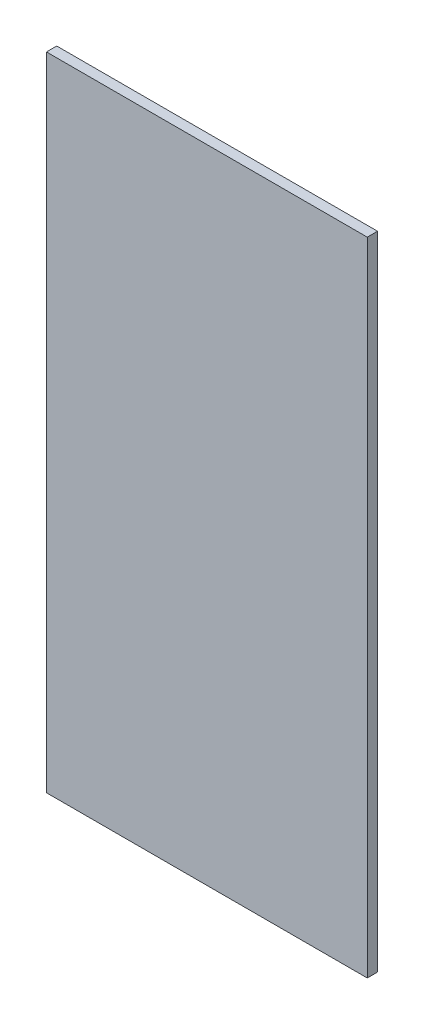
ISO-10303-21;
HEADER;
FILE_DESCRIPTION(('STEP AP214'),'2;1');
FILE_NAME('part.step','',(''),(''),'','','');
FILE_SCHEMA(('AUTOMOTIVE_DESIGN { 1 0 10303 214 1 1 1 1 }'));
ENDSEC;
DATA;
#1=APPLICATION_CONTEXT('core data for automotive mechanical design processes');
#2=APPLICATION_PROTOCOL_DEFINITION('international standard','automotive_design',2000,#1);
#3=PRODUCT_CONTEXT('',#1,'mechanical');
#4=PRODUCT('Part','Part','',(#3));
#5=PRODUCT_RELATED_PRODUCT_CATEGORY('part','',(#4));
#6=PRODUCT_DEFINITION_FORMATION('','',#4);
#7=PRODUCT_DEFINITION_CONTEXT('part definition',#1,'design');
#8=PRODUCT_DEFINITION('design','',#6,#7);
#9=PRODUCT_DEFINITION_SHAPE('','',#8);
#10=(LENGTH_UNIT() NAMED_UNIT(*) SI_UNIT(.MILLI.,.METRE.));
#11=(NAMED_UNIT(*) PLANE_ANGLE_UNIT() SI_UNIT($,.RADIAN.));
#12=(NAMED_UNIT(*) SI_UNIT($,.STERADIAN.) SOLID_ANGLE_UNIT());
#13=UNCERTAINTY_MEASURE_WITH_UNIT(LENGTH_MEASURE(1.E-05),#10,'distance_accuracy_value','');
#14=(GEOMETRIC_REPRESENTATION_CONTEXT(3) GLOBAL_UNCERTAINTY_ASSIGNED_CONTEXT((#13)) GLOBAL_UNIT_ASSIGNED_CONTEXT((#10,
#11,#12)) REPRESENTATION_CONTEXT('',''));
#15=CARTESIAN_POINT('',(0.,0.,0.));
#16=DIRECTION('',(0.,0.,1.));
#17=DIRECTION('',(1.,0.,0.));
#18=AXIS2_PLACEMENT_3D('',#15,#16,#17);
#19=CARTESIAN_POINT('',(0.,0.,1.6));
#20=DIRECTION('',(1.,0.,0.));
#21=DIRECTION('',(0.,1.,0.));
#22=AXIS2_PLACEMENT_3D('',#19,#20,#21);
#23=PLANE('',#22);
#24=DIRECTION('',(0.,-1.,0.));
#25=VECTOR('',#24,1.);
#26=CARTESIAN_POINT('',(0.,0.,0.));
#27=LINE('',#26,#25);
#28=CARTESIAN_POINT('',(0.,0.,0.));
#29=VERTEX_POINT('',#28);
#30=CARTESIAN_POINT('',(0.,-100.,0.));
#31=VERTEX_POINT('',#30);
#32=EDGE_CURVE('E98',#29,#31,#27,.T.);
#33=ORIENTED_EDGE('',*,*,#32,.T.);
#34=DIRECTION('',(0.,0.,-1.));
#35=VECTOR('',#34,1.);
#36=CARTESIAN_POINT('',(0.,-100.,1.6));
#37=LINE('',#36,#35);
#38=CARTESIAN_POINT('',(0.,-100.,1.6));
#39=VERTEX_POINT('',#38);
#40=EDGE_CURVE('E11',#39,#31,#37,.T.);
#41=ORIENTED_EDGE('',*,*,#40,.F.);
#42=DIRECTION('',(0.,-1.,0.));
#43=VECTOR('',#42,1.);
#44=CARTESIAN_POINT('',(0.,0.,1.6));
#45=LINE('',#44,#43);
#46=CARTESIAN_POINT('',(0.,0.,1.6));
#47=VERTEX_POINT('',#46);
#48=EDGE_CURVE('E86',#47,#39,#45,.T.);
#49=ORIENTED_EDGE('',*,*,#48,.F.);
#50=DIRECTION('',(0.,0.,-1.));
#51=VECTOR('',#50,1.);
#52=CARTESIAN_POINT('',(0.,0.,1.6));
#53=LINE('',#52,#51);
#54=EDGE_CURVE('E94',#47,#29,#53,.T.);
#55=ORIENTED_EDGE('',*,*,#54,.T.);
#56=EDGE_LOOP('',(#33,#41,#49,#55));
#57=FACE_BOUND('',#56,.T.);
#58=ADVANCED_FACE('F35',(#57),#23,.F.);
#59=CARTESIAN_POINT('',(0.,-100.,1.6));
#60=DIRECTION('',(0.,1.,0.));
#61=DIRECTION('',(0.,0.,1.));
#62=AXIS2_PLACEMENT_3D('',#59,#60,#61);
#63=PLANE('',#62);
#64=DIRECTION('',(1.,0.,0.));
#65=VECTOR('',#64,1.);
#66=CARTESIAN_POINT('',(0.,-100.,0.));
#67=LINE('',#66,#65);
#68=CARTESIAN_POINT('',(50.,-100.,0.));
#69=VERTEX_POINT('',#68);
#70=EDGE_CURVE('E90',#31,#69,#67,.T.);
#71=ORIENTED_EDGE('',*,*,#70,.T.);
#72=DIRECTION('',(0.,0.,-1.));
#73=VECTOR('',#72,1.);
#74=CARTESIAN_POINT('',(50.,-100.,1.6));
#75=LINE('',#74,#73);
#76=CARTESIAN_POINT('',(50.,-100.,1.6));
#77=VERTEX_POINT('',#76);
#78=EDGE_CURVE('E43',#77,#69,#75,.T.);
#79=ORIENTED_EDGE('',*,*,#78,.F.);
#80=DIRECTION('',(1.,0.,0.));
#81=VECTOR('',#80,1.);
#82=CARTESIAN_POINT('',(0.,-100.,1.6));
#83=LINE('',#82,#81);
#84=EDGE_CURVE('E81',#39,#77,#83,.T.);
#85=ORIENTED_EDGE('',*,*,#84,.F.);
#86=ORIENTED_EDGE('',*,*,#40,.T.);
#87=EDGE_LOOP('',(#71,#79,#85,#86));
#88=FACE_BOUND('',#87,.T.);
#89=ADVANCED_FACE('F89',(#88),#63,.F.);
#90=CARTESIAN_POINT('',(50.,0.,1.6));
#91=DIRECTION('',(-1.,0.,0.));
#92=DIRECTION('',(0.,-1.,0.));
#93=AXIS2_PLACEMENT_3D('',#90,#91,#92);
#94=PLANE('',#93);
#95=DIRECTION('',(0.,1.,0.));
#96=VECTOR('',#95,1.);
#97=CARTESIAN_POINT('',(50.,0.,0.));
#98=LINE('',#97,#96);
#99=CARTESIAN_POINT('',(50.,0.,0.));
#100=VERTEX_POINT('',#99);
#101=EDGE_CURVE('E68',#69,#100,#98,.T.);
#102=ORIENTED_EDGE('',*,*,#101,.T.);
#103=DIRECTION('',(0.,0.,-1.));
#104=VECTOR('',#103,1.);
#105=CARTESIAN_POINT('',(50.,0.,1.6));
#106=LINE('',#105,#104);
#107=CARTESIAN_POINT('',(50.,0.,1.6));
#108=VERTEX_POINT('',#107);
#109=EDGE_CURVE('E91',#108,#100,#106,.T.);
#110=ORIENTED_EDGE('',*,*,#109,.F.);
#111=DIRECTION('',(0.,1.,0.));
#112=VECTOR('',#111,1.);
#113=CARTESIAN_POINT('',(50.,0.,1.6));
#114=LINE('',#113,#112);
#115=EDGE_CURVE('E84',#77,#108,#114,.T.);
#116=ORIENTED_EDGE('',*,*,#115,.F.);
#117=ORIENTED_EDGE('',*,*,#78,.T.);
#118=EDGE_LOOP('',(#102,#110,#116,#117));
#119=FACE_BOUND('',#118,.T.);
#120=ADVANCED_FACE('F92',(#119),#94,.F.);
#121=CARTESIAN_POINT('',(0.,0.,1.6));
#122=DIRECTION('',(0.,-1.,0.));
#123=DIRECTION('',(0.,0.,-1.));
#124=AXIS2_PLACEMENT_3D('',#121,#122,#123);
#125=PLANE('',#124);
#126=DIRECTION('',(-1.,0.,0.));
#127=VECTOR('',#126,1.);
#128=CARTESIAN_POINT('',(0.,0.,0.));
#129=LINE('',#128,#127);
#130=EDGE_CURVE('E74',#100,#29,#129,.T.);
#131=ORIENTED_EDGE('',*,*,#130,.T.);
#132=ORIENTED_EDGE('',*,*,#54,.F.);
#133=DIRECTION('',(-1.,0.,0.));
#134=VECTOR('',#133,1.);
#135=CARTESIAN_POINT('',(0.,0.,1.6));
#136=LINE('',#135,#134);
#137=EDGE_CURVE('E51',#108,#47,#136,.T.);
#138=ORIENTED_EDGE('',*,*,#137,.F.);
#139=ORIENTED_EDGE('',*,*,#109,.T.);
#140=EDGE_LOOP('',(#131,#132,#138,#139));
#141=FACE_BOUND('',#140,.T.);
#142=ADVANCED_FACE('F105',(#141),#125,.F.);
#143=CARTESIAN_POINT('',(0.,-100.,1.6));
#144=DIRECTION('',(0.,0.,1.));
#145=DIRECTION('',(1.,0.,0.));
#146=AXIS2_PLACEMENT_3D('',#143,#144,#145);
#147=PLANE('',#146);
#148=ORIENTED_EDGE('',*,*,#48,.T.);
#149=ORIENTED_EDGE('',*,*,#84,.T.);
#150=ORIENTED_EDGE('',*,*,#115,.T.);
#151=ORIENTED_EDGE('',*,*,#137,.T.);
#152=EDGE_LOOP('',(#148,#149,#150,#151));
#153=FACE_BOUND('',#152,.T.);
#154=ADVANCED_FACE('F82',(#153),#147,.T.);
#155=CARTESIAN_POINT('',(0.,-100.,0.));
#156=DIRECTION('',(0.,0.,1.));
#157=DIRECTION('',(1.,0.,0.));
#158=AXIS2_PLACEMENT_3D('',#155,#156,#157);
#159=PLANE('',#158);
#160=ORIENTED_EDGE('',*,*,#32,.F.);
#161=ORIENTED_EDGE('',*,*,#130,.F.);
#162=ORIENTED_EDGE('',*,*,#101,.F.);
#163=ORIENTED_EDGE('',*,*,#70,.F.);
#164=EDGE_LOOP('',(#160,#161,#162,#163));
#165=FACE_BOUND('',#164,.T.);
#166=ADVANCED_FACE('F108',(#165),#159,.F.);
#167=CLOSED_SHELL('',(#58,#89,#120,#142,#154,#166));
#168=MANIFOLD_SOLID_BREP('B2',#167);
#169=ADVANCED_BREP_SHAPE_REPRESENTATION('',(#18,#168),#14);
#170=SHAPE_DEFINITION_REPRESENTATION(#9,#169);
ENDSEC;
END-ISO-10303-21;
